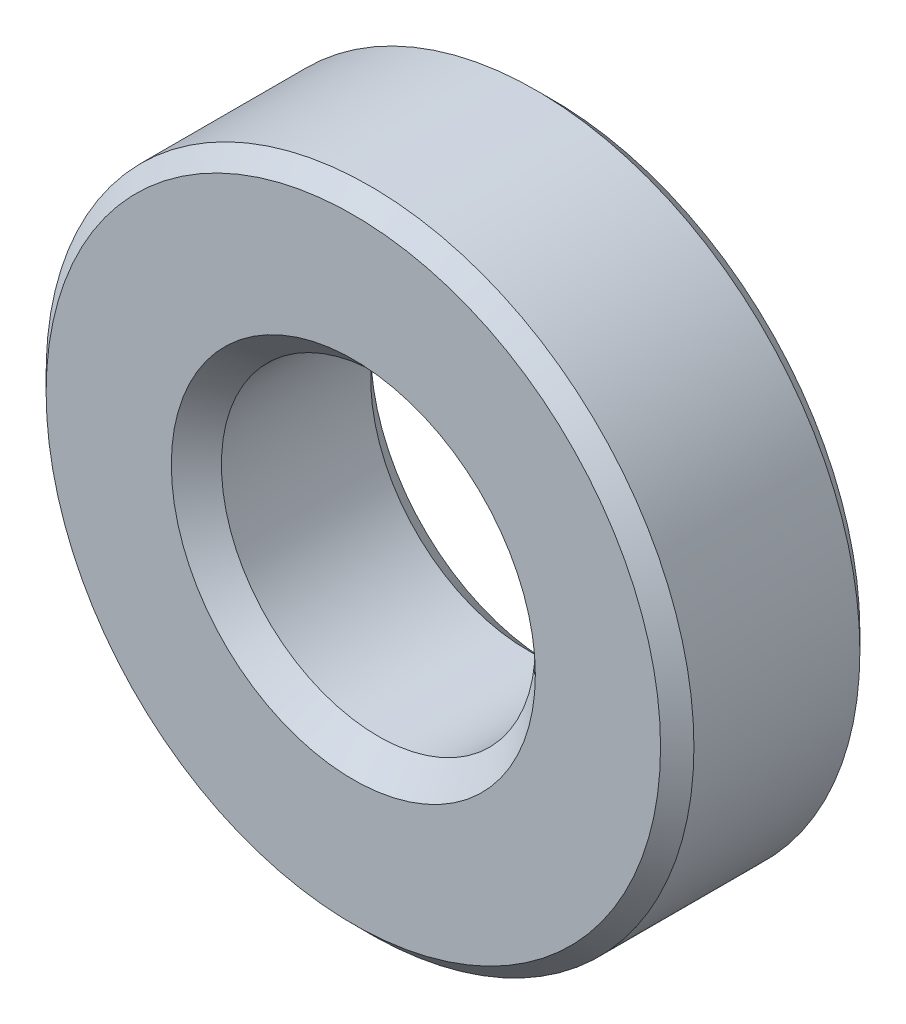
ISO-10303-21;
HEADER;
FILE_DESCRIPTION(('STEP AP214'),'2;1');
FILE_NAME('part.step','',(''),(''),'','','');
FILE_SCHEMA(('AUTOMOTIVE_DESIGN { 1 0 10303 214 1 1 1 1 }'));
ENDSEC;
DATA;
#1=APPLICATION_CONTEXT('core data for automotive mechanical design processes');
#2=APPLICATION_PROTOCOL_DEFINITION('international standard','automotive_design',2000,#1);
#3=PRODUCT_CONTEXT('',#1,'mechanical');
#4=PRODUCT('Part','Part','',(#3));
#5=PRODUCT_RELATED_PRODUCT_CATEGORY('part','',(#4));
#6=PRODUCT_DEFINITION_FORMATION('','',#4);
#7=PRODUCT_DEFINITION_CONTEXT('part definition',#1,'design');
#8=PRODUCT_DEFINITION('design','',#6,#7);
#9=PRODUCT_DEFINITION_SHAPE('','',#8);
#10=(LENGTH_UNIT() NAMED_UNIT(*) SI_UNIT(.MILLI.,.METRE.));
#11=(NAMED_UNIT(*) PLANE_ANGLE_UNIT() SI_UNIT($,.RADIAN.));
#12=(NAMED_UNIT(*) SI_UNIT($,.STERADIAN.) SOLID_ANGLE_UNIT());
#13=UNCERTAINTY_MEASURE_WITH_UNIT(LENGTH_MEASURE(1.E-05),#10,'distance_accuracy_value','');
#14=(GEOMETRIC_REPRESENTATION_CONTEXT(3) GLOBAL_UNCERTAINTY_ASSIGNED_CONTEXT((#13)) GLOBAL_UNIT_ASSIGNED_CONTEXT((#10,
#11,#12)) REPRESENTATION_CONTEXT('',''));
#15=CARTESIAN_POINT('',(0.,0.,0.));
#16=DIRECTION('',(0.,0.,1.));
#17=DIRECTION('',(1.,0.,0.));
#18=AXIS2_PLACEMENT_3D('',#15,#16,#17);
#19=CARTESIAN_POINT('',(0.,0.,-2.));
#20=DIRECTION('',(0.,0.,1.));
#21=DIRECTION('',(1.,0.,0.));
#22=AXIS2_PLACEMENT_3D('',#19,#20,#21);
#23=CYLINDRICAL_SURFACE('',#22,6.5);
#24=CARTESIAN_POINT('',(0.,0.,1.665));
#25=DIRECTION('',(0.,0.,1.));
#26=DIRECTION('',(1.,0.,0.));
#27=AXIS2_PLACEMENT_3D('',#24,#25,#26);
#28=CIRCLE('',#27,6.5);
#29=CARTESIAN_POINT('',(6.5,0.,1.665));
#30=VERTEX_POINT('',#29);
#31=EDGE_CURVE('E57',#30,#30,#28,.F.);
#32=CARTESIAN_POINT('',(0.,0.,-1.665));
#33=DIRECTION('',(0.,0.,1.));
#34=DIRECTION('',(1.,0.,0.));
#35=AXIS2_PLACEMENT_3D('',#32,#33,#34);
#36=CIRCLE('',#35,6.5);
#37=CARTESIAN_POINT('',(6.5,0.,-1.665));
#38=VERTEX_POINT('',#37);
#39=EDGE_CURVE('E60',#38,#38,#36,.T.);
#40=CARTESIAN_POINT('',(6.5,0.,1.665));
#41=CARTESIAN_POINT('',(6.5,0.,1.6303125));
#42=CARTESIAN_POINT('',(6.5,0.,1.595625));
#43=CARTESIAN_POINT('',(6.5,0.,1.52625));
#44=CARTESIAN_POINT('',(6.5,0.,1.4915625));
#45=CARTESIAN_POINT('',(6.5,0.,1.4221875));
#46=CARTESIAN_POINT('',(6.5,0.,1.3875));
#47=CARTESIAN_POINT('',(6.5,0.,1.318125));
#48=CARTESIAN_POINT('',(6.5,0.,1.2834375));
#49=CARTESIAN_POINT('',(6.5,0.,1.2140625));
#50=CARTESIAN_POINT('',(6.5,0.,1.179375));
#51=CARTESIAN_POINT('',(6.5,0.,1.11));
#52=CARTESIAN_POINT('',(6.5,0.,1.0753125));
#53=CARTESIAN_POINT('',(6.5,0.,1.0059375));
#54=CARTESIAN_POINT('',(6.5,0.,0.971250000000002));
#55=CARTESIAN_POINT('',(6.5,0.,0.901875000000002));
#56=CARTESIAN_POINT('',(6.5,0.,0.867187500000002));
#57=CARTESIAN_POINT('',(6.5,0.,0.797812500000002));
#58=CARTESIAN_POINT('',(6.5,0.,0.763125000000002));
#59=CARTESIAN_POINT('',(6.5,0.,0.693750000000002));
#60=CARTESIAN_POINT('',(6.5,0.,0.659062500000002));
#61=CARTESIAN_POINT('',(6.5,0.,0.589687500000002));
#62=CARTESIAN_POINT('',(6.5,0.,0.555000000000002));
#63=CARTESIAN_POINT('',(6.5,0.,0.485625000000002));
#64=CARTESIAN_POINT('',(6.5,0.,0.450937500000001));
#65=CARTESIAN_POINT('',(6.5,0.,0.381562500000001));
#66=CARTESIAN_POINT('',(6.5,0.,0.346875000000001));
#67=CARTESIAN_POINT('',(6.5,0.,0.277500000000001));
#68=CARTESIAN_POINT('',(6.5,0.,0.242812500000001));
#69=CARTESIAN_POINT('',(6.5,0.,0.173437500000001));
#70=CARTESIAN_POINT('',(6.5,0.,0.138750000000001));
#71=CARTESIAN_POINT('',(6.5,0.,0.0693750000000013));
#72=CARTESIAN_POINT('',(6.5,0.,0.0346875000000013));
#73=CARTESIAN_POINT('',(6.5,0.,-0.0346874999999987));
#74=CARTESIAN_POINT('',(6.5,0.,-0.0693749999999987));
#75=CARTESIAN_POINT('',(6.5,0.,-0.138749999999999));
#76=CARTESIAN_POINT('',(6.5,0.,-0.173437499999999));
#77=CARTESIAN_POINT('',(6.5,0.,-0.242812499999999));
#78=CARTESIAN_POINT('',(6.5,0.,-0.277499999999999));
#79=CARTESIAN_POINT('',(6.5,0.,-0.346874999999999));
#80=CARTESIAN_POINT('',(6.5,0.,-0.381562499999999));
#81=CARTESIAN_POINT('',(6.5,0.,-0.450937499999999));
#82=CARTESIAN_POINT('',(6.5,0.,-0.485624999999999));
#83=CARTESIAN_POINT('',(6.5,0.,-0.554999999999999));
#84=CARTESIAN_POINT('',(6.5,0.,-0.589687499999999));
#85=CARTESIAN_POINT('',(6.5,0.,-0.659062499999999));
#86=CARTESIAN_POINT('',(6.5,0.,-0.693749999999999));
#87=CARTESIAN_POINT('',(6.5,0.,-0.763124999999999));
#88=CARTESIAN_POINT('',(6.5,0.,-0.797812499999999));
#89=CARTESIAN_POINT('',(6.5,0.,-0.867187499999999));
#90=CARTESIAN_POINT('',(6.5,0.,-0.901874999999999));
#91=CARTESIAN_POINT('',(6.5,0.,-0.971249999999999));
#92=CARTESIAN_POINT('',(6.5,0.,-1.0059375));
#93=CARTESIAN_POINT('',(6.5,0.,-1.0753125));
#94=CARTESIAN_POINT('',(6.5,0.,-1.11));
#95=CARTESIAN_POINT('',(6.5,0.,-1.179375));
#96=CARTESIAN_POINT('',(6.5,0.,-1.2140625));
#97=CARTESIAN_POINT('',(6.5,0.,-1.2834375));
#98=CARTESIAN_POINT('',(6.5,0.,-1.318125));
#99=CARTESIAN_POINT('',(6.5,0.,-1.3875));
#100=CARTESIAN_POINT('',(6.5,0.,-1.4221875));
#101=CARTESIAN_POINT('',(6.5,0.,-1.4915625));
#102=CARTESIAN_POINT('',(6.5,0.,-1.52625));
#103=CARTESIAN_POINT('',(6.5,0.,-1.595625));
#104=CARTESIAN_POINT('',(6.5,0.,-1.6303125));
#105=CARTESIAN_POINT('',(6.5,0.,-1.665));
#106=B_SPLINE_CURVE_WITH_KNOTS('',3,(#40,#41,#42,#43,#44,#45,#46,#47,#48,#49,#50,#51,#52,#53,
#54,#55,#56,#57,#58,#59,#60,#61,#62,#63,#64,#65,#66,#67,#68,#69,#70,#71,#72,#73,#74,#75,#76,#77,
#78,#79,#80,#81,#82,#83,#84,#85,#86,#87,#88,#89,#90,#91,#92,#93,#94,#95,#96,#97,#98,#99,#100,
#101,#102,#103,#104,#105),.UNSPECIFIED.,.F.,.F.,(4,2,2,2,2,2,2,2,2,2,2,2,2,2,2,2,2,2,2,2,2,2,2,
2,2,2,2,2,2,2,2,2,4),(0.,0.1040625,0.208125,0.3121875,0.41625,0.5203125,0.624375,0.7284375,
0.8325,0.9365625,1.040625,1.1446875,1.24875,1.3528125,1.456875,1.5609375,1.665,1.7690625,
1.873125,1.9771875,2.08125,2.1853125,2.289375,2.3934375,2.4975,2.6015625,2.705625,2.8096875,
2.91375,3.0178125,3.121875,3.2259375,3.33),.UNSPECIFIED.);
#107=EDGE_CURVE('BSEAM34',#30,#38,#106,.T.);
#108=ORIENTED_EDGE('',*,*,#31,.T.);
#109=ORIENTED_EDGE('',*,*,#39,.T.);
#110=ORIENTED_EDGE('',*,*,#107,.T.);
#111=ORIENTED_EDGE('',*,*,#107,.F.);
#112=EDGE_LOOP('',(#108,#110,#109,#111));
#113=FACE_BOUND('',#112,.T.);
#114=ADVANCED_FACE('F34',(#113),#23,.T.);
#115=CARTESIAN_POINT('',(0.,0.,-2.));
#116=DIRECTION('',(0.,0.,1.));
#117=DIRECTION('',(1.,0.,0.));
#118=AXIS2_PLACEMENT_3D('',#115,#116,#117);
#119=PLANE('',#118);
#120=CARTESIAN_POINT('',(0.,0.,-2.));
#121=DIRECTION('',(0.,0.,1.));
#122=DIRECTION('',(1.,0.,0.));
#123=AXIS2_PLACEMENT_3D('',#120,#121,#122);
#124=CIRCLE('',#123,3.6525);
#125=CARTESIAN_POINT('',(3.6525,0.,-2.));
#126=VERTEX_POINT('',#125);
#127=EDGE_CURVE('E10',#126,#126,#124,.T.);
#128=ORIENTED_EDGE('',*,*,#127,.T.);
#129=EDGE_LOOP('',(#128));
#130=FACE_BOUND('',#129,.T.);
#131=CARTESIAN_POINT('',(0.,0.,-2.));
#132=DIRECTION('',(0.,0.,1.));
#133=DIRECTION('',(1.,0.,0.));
#134=AXIS2_PLACEMENT_3D('',#131,#132,#133);
#135=CIRCLE('',#134,6.165);
#136=CARTESIAN_POINT('',(6.165,0.,-2.));
#137=VERTEX_POINT('',#136);
#138=EDGE_CURVE('E54',#137,#137,#135,.F.);
#139=ORIENTED_EDGE('',*,*,#138,.T.);
#140=EDGE_LOOP('',(#139));
#141=FACE_BOUND('',#140,.T.);
#142=ADVANCED_FACE('F86',(#130,#141),#119,.F.);
#143=CARTESIAN_POINT('',(0.,0.,-2.));
#144=DIRECTION('',(0.,0.,1.));
#145=DIRECTION('',(1.,0.,0.));
#146=AXIS2_PLACEMENT_3D('',#143,#144,#145);
#147=CYLINDRICAL_SURFACE('',#146,3.15);
#148=CARTESIAN_POINT('',(0.,0.,1.4975));
#149=DIRECTION('',(0.,0.,1.));
#150=DIRECTION('',(1.,0.,0.));
#151=AXIS2_PLACEMENT_3D('',#148,#149,#150);
#152=CIRCLE('',#151,3.15);
#153=CARTESIAN_POINT('',(3.15,0.,1.4975));
#154=VERTEX_POINT('',#153);
#155=EDGE_CURVE('E45',#154,#154,#152,.T.);
#156=ORIENTED_EDGE('',*,*,#155,.T.);
#157=EDGE_LOOP('',(#156));
#158=FACE_BOUND('',#157,.T.);
#159=CARTESIAN_POINT('',(0.,0.,-1.4975));
#160=DIRECTION('',(0.,0.,1.));
#161=DIRECTION('',(1.,0.,0.));
#162=AXIS2_PLACEMENT_3D('',#159,#160,#161);
#163=CIRCLE('',#162,3.15);
#164=CARTESIAN_POINT('',(3.15,0.,-1.4975));
#165=VERTEX_POINT('',#164);
#166=EDGE_CURVE('E49',#165,#165,#163,.F.);
#167=ORIENTED_EDGE('',*,*,#166,.T.);
#168=EDGE_LOOP('',(#167));
#169=FACE_BOUND('',#168,.T.);
#170=ADVANCED_FACE('F81',(#158,#169),#147,.F.);
#171=CARTESIAN_POINT('',(0.,0.,2.));
#172=DIRECTION('',(0.,0.,1.));
#173=DIRECTION('',(1.,0.,0.));
#174=AXIS2_PLACEMENT_3D('',#171,#172,#173);
#175=PLANE('',#174);
#176=CARTESIAN_POINT('',(0.,0.,2.));
#177=DIRECTION('',(0.,0.,1.));
#178=DIRECTION('',(1.,0.,0.));
#179=AXIS2_PLACEMENT_3D('',#176,#177,#178);
#180=CIRCLE('',#179,3.6525);
#181=CARTESIAN_POINT('',(3.6525,0.,2.));
#182=VERTEX_POINT('',#181);
#183=EDGE_CURVE('E41',#182,#182,#180,.F.);
#184=ORIENTED_EDGE('',*,*,#183,.T.);
#185=EDGE_LOOP('',(#184));
#186=FACE_BOUND('',#185,.T.);
#187=CARTESIAN_POINT('',(0.,0.,2.));
#188=DIRECTION('',(0.,0.,1.));
#189=DIRECTION('',(1.,0.,0.));
#190=AXIS2_PLACEMENT_3D('',#187,#188,#189);
#191=CIRCLE('',#190,6.165);
#192=CARTESIAN_POINT('',(6.165,0.,2.));
#193=VERTEX_POINT('',#192);
#194=EDGE_CURVE('E63',#193,#193,#191,.T.);
#195=ORIENTED_EDGE('',*,*,#194,.T.);
#196=EDGE_LOOP('',(#195));
#197=FACE_BOUND('',#196,.T.);
#198=ADVANCED_FACE('F67',(#186,#197),#175,.T.);
#199=CARTESIAN_POINT('',(0.,0.,2.));
#200=DIRECTION('',(0.,0.,-1.));
#201=DIRECTION('',(-1.,0.,0.));
#202=AXIS2_PLACEMENT_3D('',#199,#200,#201);
#203=CONICAL_SURFACE('',#202,6.165,0.785398163397446);
#204=ORIENTED_EDGE('',*,*,#31,.F.);
#205=EDGE_LOOP('',(#204));
#206=FACE_BOUND('',#205,.T.);
#207=ORIENTED_EDGE('',*,*,#194,.F.);
#208=EDGE_LOOP('',(#207));
#209=FACE_BOUND('',#208,.T.);
#210=ADVANCED_FACE('F69',(#206,#209),#203,.T.);
#211=CARTESIAN_POINT('',(0.,0.,-1.665));
#212=DIRECTION('',(0.,0.,1.));
#213=DIRECTION('',(1.,0.,0.));
#214=AXIS2_PLACEMENT_3D('',#211,#212,#213);
#215=CONICAL_SURFACE('',#214,6.5,0.785398163397452);
#216=CARTESIAN_POINT('',(6.165,0.,-2.));
#217=CARTESIAN_POINT('',(6.16848958333333,0.,-1.99651041666667));
#218=CARTESIAN_POINT('',(6.17197916666666,0.,-1.99302083333333));
#219=CARTESIAN_POINT('',(6.17895833333333,0.,-1.98604166666667));
#220=CARTESIAN_POINT('',(6.18244791666666,0.,-1.98255208333333));
#221=CARTESIAN_POINT('',(6.18942708333333,0.,-1.97557291666667));
#222=CARTESIAN_POINT('',(6.19291666666666,0.,-1.97208333333333));
#223=CARTESIAN_POINT('',(6.19989583333333,0.,-1.96510416666667));
#224=CARTESIAN_POINT('',(6.20338541666666,0.,-1.96161458333333));
#225=CARTESIAN_POINT('',(6.21036458333333,0.,-1.95463541666667));
#226=CARTESIAN_POINT('',(6.21385416666666,0.,-1.95114583333333));
#227=CARTESIAN_POINT('',(6.22083333333333,0.,-1.94416666666667));
#228=CARTESIAN_POINT('',(6.22432291666666,0.,-1.94067708333333));
#229=CARTESIAN_POINT('',(6.23130208333333,0.,-1.93369791666667));
#230=CARTESIAN_POINT('',(6.23479166666666,0.,-1.93020833333333));
#231=CARTESIAN_POINT('',(6.24177083333333,0.,-1.92322916666667));
#232=CARTESIAN_POINT('',(6.24526041666666,0.,-1.91973958333333));
#233=CARTESIAN_POINT('',(6.25223958333333,0.,-1.91276041666667));
#234=CARTESIAN_POINT('',(6.25572916666666,0.,-1.90927083333333));
#235=CARTESIAN_POINT('',(6.26270833333333,0.,-1.90229166666667));
#236=CARTESIAN_POINT('',(6.26619791666666,0.,-1.89880208333333));
#237=CARTESIAN_POINT('',(6.27317708333333,0.,-1.89182291666667));
#238=CARTESIAN_POINT('',(6.27666666666666,0.,-1.88833333333333));
#239=CARTESIAN_POINT('',(6.28364583333333,0.,-1.88135416666667));
#240=CARTESIAN_POINT('',(6.28713541666666,0.,-1.87786458333333));
#241=CARTESIAN_POINT('',(6.29411458333333,0.,-1.87088541666667));
#242=CARTESIAN_POINT('',(6.29760416666667,0.,-1.86739583333333));
#243=CARTESIAN_POINT('',(6.30458333333333,0.,-1.86041666666667));
#244=CARTESIAN_POINT('',(6.30807291666667,0.,-1.85692708333333));
#245=CARTESIAN_POINT('',(6.31505208333333,0.,-1.84994791666667));
#246=CARTESIAN_POINT('',(6.31854166666666,0.,-1.84645833333333));
#247=CARTESIAN_POINT('',(6.32552083333333,0.,-1.83947916666667));
#248=CARTESIAN_POINT('',(6.32901041666666,0.,-1.83598958333333));
#249=CARTESIAN_POINT('',(6.33598958333333,0.,-1.82901041666667));
#250=CARTESIAN_POINT('',(6.33947916666667,0.,-1.82552083333333));
#251=CARTESIAN_POINT('',(6.34645833333333,0.,-1.81854166666667));
#252=CARTESIAN_POINT('',(6.34994791666667,0.,-1.81505208333333));
#253=CARTESIAN_POINT('',(6.35692708333333,0.,-1.80807291666667));
#254=CARTESIAN_POINT('',(6.36041666666666,0.,-1.80458333333333));
#255=CARTESIAN_POINT('',(6.36739583333333,0.,-1.79760416666667));
#256=CARTESIAN_POINT('',(6.37088541666667,0.,-1.79411458333333));
#257=CARTESIAN_POINT('',(6.37786458333333,0.,-1.78713541666667));
#258=CARTESIAN_POINT('',(6.38135416666667,0.,-1.78364583333333));
#259=CARTESIAN_POINT('',(6.38833333333333,0.,-1.77666666666667));
#260=CARTESIAN_POINT('',(6.39182291666667,0.,-1.77317708333333));
#261=CARTESIAN_POINT('',(6.39880208333333,0.,-1.76619791666667));
#262=CARTESIAN_POINT('',(6.40229166666667,0.,-1.76270833333333));
#263=CARTESIAN_POINT('',(6.40927083333333,0.,-1.75572916666667));
#264=CARTESIAN_POINT('',(6.41276041666667,0.,-1.75223958333333));
#265=CARTESIAN_POINT('',(6.41973958333333,0.,-1.74526041666667));
#266=CARTESIAN_POINT('',(6.42322916666667,0.,-1.74177083333333));
#267=CARTESIAN_POINT('',(6.43020833333333,0.,-1.73479166666667));
#268=CARTESIAN_POINT('',(6.43369791666667,0.,-1.73130208333333));
#269=CARTESIAN_POINT('',(6.44067708333333,0.,-1.72432291666667));
#270=CARTESIAN_POINT('',(6.44416666666667,0.,-1.72083333333333));
#271=CARTESIAN_POINT('',(6.45114583333333,0.,-1.71385416666667));
#272=CARTESIAN_POINT('',(6.45463541666667,0.,-1.71036458333333));
#273=CARTESIAN_POINT('',(6.46161458333333,0.,-1.70338541666667));
#274=CARTESIAN_POINT('',(6.46510416666667,0.,-1.69989583333333));
#275=CARTESIAN_POINT('',(6.47208333333333,0.,-1.69291666666667));
#276=CARTESIAN_POINT('',(6.47557291666667,0.,-1.68942708333333));
#277=CARTESIAN_POINT('',(6.48255208333333,0.,-1.68244791666667));
#278=CARTESIAN_POINT('',(6.48604166666667,0.,-1.67895833333333));
#279=CARTESIAN_POINT('',(6.49302083333333,0.,-1.67197916666667));
#280=CARTESIAN_POINT('',(6.49651041666667,0.,-1.66848958333333));
#281=CARTESIAN_POINT('',(6.5,0.,-1.665));
#282=B_SPLINE_CURVE_WITH_KNOTS('',3,(#216,#217,#218,#219,#220,#221,#222,#223,#224,#225,#226,
#227,#228,#229,#230,#231,#232,#233,#234,#235,#236,#237,#238,#239,#240,#241,#242,#243,#244,#245,
#246,#247,#248,#249,#250,#251,#252,#253,#254,#255,#256,#257,#258,#259,#260,#261,#262,#263,#264,
#265,#266,#267,#268,#269,#270,#271,#272,#273,#274,#275,#276,#277,#278,#279,#280,#281),
.UNSPECIFIED.,.F.,.F.,(4,2,2,2,2,2,2,2,2,2,2,2,2,2,2,2,2,2,2,2,2,2,2,2,2,2,2,2,2,2,2,2,4),(0.,
0.0148050482310934,0.0296100964621869,0.0444151446932803,0.0592201929243737,0.0740252411554671,
0.0888302893865605,0.103635337617654,0.118440385848747,0.133245434079841,0.148050482310934,
0.162855530542028,0.177660578773121,0.192465627004215,0.207270675235308,0.222075723466402,
0.236880771697495,0.251685819928589,0.266490868159682,0.281295916390775,0.296100964621869,
0.310906012852962,0.325711061084056,0.340516109315149,0.355321157546242,0.370126205777336,
0.384931254008429,0.399736302239523,0.414541350470617,0.42934639870171,0.444151446932804,
0.458956495163897,0.473761543394991),.UNSPECIFIED.);
#283=EDGE_CURVE('BSEAM71',#137,#38,#282,.T.);
#284=ORIENTED_EDGE('',*,*,#138,.F.);
#285=ORIENTED_EDGE('',*,*,#39,.F.);
#286=ORIENTED_EDGE('',*,*,#283,.T.);
#287=ORIENTED_EDGE('',*,*,#283,.F.);
#288=EDGE_LOOP('',(#284,#286,#285,#287));
#289=FACE_BOUND('',#288,.T.);
#290=ADVANCED_FACE('F71',(#289),#215,.T.);
#291=CARTESIAN_POINT('',(0.,0.,1.4975));
#292=DIRECTION('',(0.,0.,1.));
#293=DIRECTION('',(1.,0.,0.));
#294=AXIS2_PLACEMENT_3D('',#291,#292,#293);
#295=CONICAL_SURFACE('',#294,3.15,0.78539816339745);
#296=ORIENTED_EDGE('',*,*,#183,.F.);
#297=EDGE_LOOP('',(#296));
#298=FACE_BOUND('',#297,.T.);
#299=ORIENTED_EDGE('',*,*,#155,.F.);
#300=EDGE_LOOP('',(#299));
#301=FACE_BOUND('',#300,.T.);
#302=ADVANCED_FACE('F78',(#298,#301),#295,.F.);
#303=CARTESIAN_POINT('',(0.,0.,-2.));
#304=DIRECTION('',(0.,0.,-1.));
#305=DIRECTION('',(-1.,0.,0.));
#306=AXIS2_PLACEMENT_3D('',#303,#304,#305);
#307=CONICAL_SURFACE('',#306,3.6525,0.785398163397445);
#308=ORIENTED_EDGE('',*,*,#166,.F.);
#309=EDGE_LOOP('',(#308));
#310=FACE_BOUND('',#309,.T.);
#311=ORIENTED_EDGE('',*,*,#127,.F.);
#312=EDGE_LOOP('',(#311));
#313=FACE_BOUND('',#312,.T.);
#314=ADVANCED_FACE('F36',(#310,#313),#307,.F.);
#315=CLOSED_SHELL('',(#114,#142,#170,#198,#210,#290,#302,#314));
#316=MANIFOLD_SOLID_BREP('B2',#315);
#317=ADVANCED_BREP_SHAPE_REPRESENTATION('',(#18,#316),#14);
#318=SHAPE_DEFINITION_REPRESENTATION(#9,#317);
ENDSEC;
END-ISO-10303-21;
